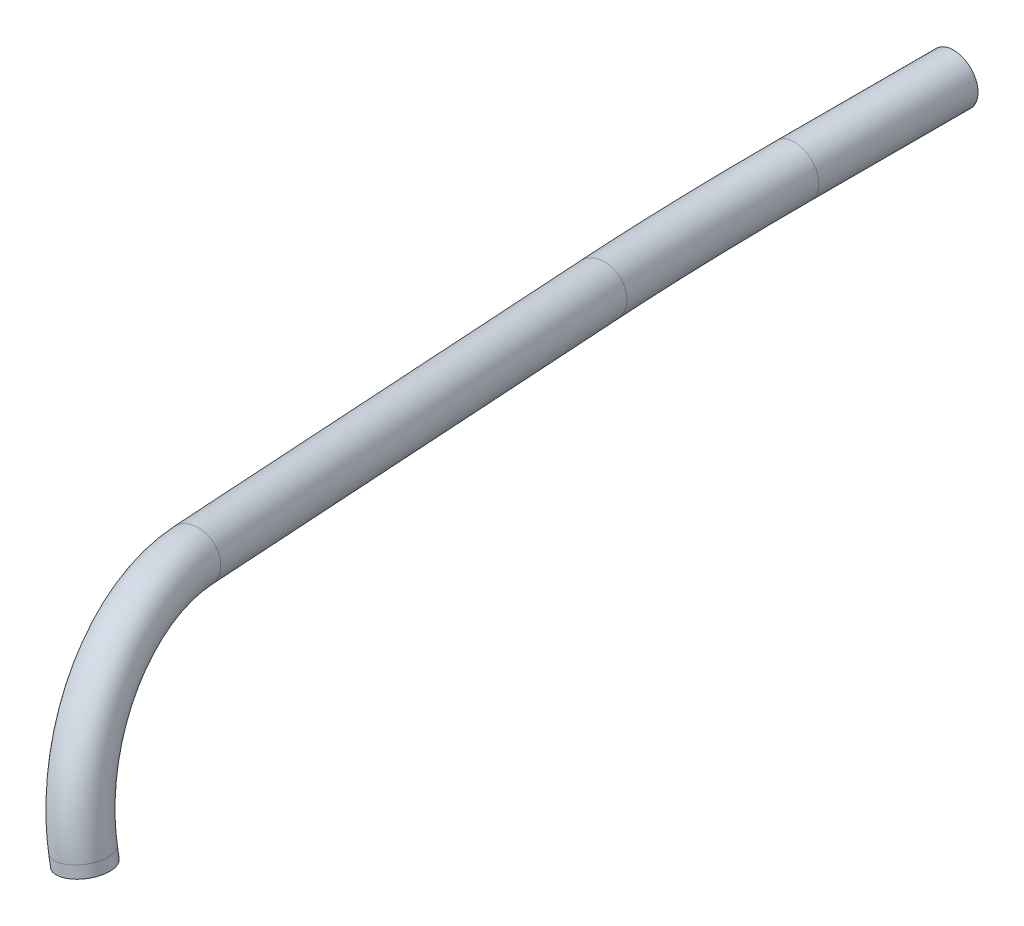
ISO-10303-21;
HEADER;
FILE_DESCRIPTION(('STEP AP214'),'2;1');
FILE_NAME('part.step','',(''),(''),'','','');
FILE_SCHEMA(('AUTOMOTIVE_DESIGN { 1 0 10303 214 1 1 1 1 }'));
ENDSEC;
DATA;
#1=APPLICATION_CONTEXT('core data for automotive mechanical design processes');
#2=APPLICATION_PROTOCOL_DEFINITION('international standard','automotive_design',2000,#1);
#3=PRODUCT_CONTEXT('',#1,'mechanical');
#4=PRODUCT('Part','Part','',(#3));
#5=PRODUCT_RELATED_PRODUCT_CATEGORY('part','',(#4));
#6=PRODUCT_DEFINITION_FORMATION('','',#4);
#7=PRODUCT_DEFINITION_CONTEXT('part definition',#1,'design');
#8=PRODUCT_DEFINITION('design','',#6,#7);
#9=PRODUCT_DEFINITION_SHAPE('','',#8);
#10=(LENGTH_UNIT() NAMED_UNIT(*) SI_UNIT(.MILLI.,.METRE.));
#11=(NAMED_UNIT(*) PLANE_ANGLE_UNIT() SI_UNIT($,.RADIAN.));
#12=(NAMED_UNIT(*) SI_UNIT($,.STERADIAN.) SOLID_ANGLE_UNIT());
#13=UNCERTAINTY_MEASURE_WITH_UNIT(LENGTH_MEASURE(1.E-05),#10,'distance_accuracy_value','');
#14=(GEOMETRIC_REPRESENTATION_CONTEXT(3) GLOBAL_UNCERTAINTY_ASSIGNED_CONTEXT((#13)) GLOBAL_UNIT_ASSIGNED_CONTEXT((#10,
#11,#12)) REPRESENTATION_CONTEXT('',''));
#15=CARTESIAN_POINT('',(0.,0.,0.));
#16=DIRECTION('',(0.,0.,1.));
#17=DIRECTION('',(1.,0.,0.));
#18=AXIS2_PLACEMENT_3D('',#15,#16,#17);
#19=CARTESIAN_POINT('',(11.3636634510779,-8.52088718881167,81.7069688917565));
#20=DIRECTION('',(0.189205503077705,-0.981664706530247,0.0231447954840272));
#21=DIRECTION('',(0.981927742052137,0.189256200396164,0.));
#22=AXIS2_PLACEMENT_3D('',#19,#20,#21);
#23=PLANE('',#22);
#24=CARTESIAN_POINT('',(11.3636634510771,-8.52088718881181,81.7069688917565));
#25=DIRECTION('',(0.189205503077705,-0.981664706530247,0.0231447954840213));
#26=DIRECTION('',(0.981927742052137,0.189256200396163,0.));
#27=AXIS2_PLACEMENT_3D('',#24,#25,#26);
#28=CIRCLE('',#27,1.98119999999999);
#29=CARTESIAN_POINT('',(13.3090586936308,-8.14593280458693,81.7069688917565));
#30=VERTEX_POINT('',#29);
#31=EDGE_CURVE('E17',#30,#30,#28,.F.);
#32=ORIENTED_EDGE('',*,*,#31,.F.);
#33=EDGE_LOOP('',(#32));
#34=FACE_BOUND('',#33,.T.);
#35=ADVANCED_FACE('F14',(#34),#23,.T.);
#36=CARTESIAN_POINT('',(0.,0.,0.));
#37=DIRECTION('',(0.,0.,1.));
#38=DIRECTION('',(1.,0.,0.));
#39=AXIS2_PLACEMENT_3D('',#36,#37,#38);
#40=PLANE('',#39);
#41=CARTESIAN_POINT('',(-1.44293222776741E-12,0.,0.));
#42=DIRECTION('',(0.,0.,-1.));
#43=DIRECTION('',(-1.,0.,0.));
#44=AXIS2_PLACEMENT_3D('',#41,#42,#43);
#45=CIRCLE('',#44,1.98119999999999);
#46=CARTESIAN_POINT('',(-1.98120000000143,0.,0.));
#47=VERTEX_POINT('',#46);
#48=EDGE_CURVE('E96',#47,#47,#45,.F.);
#49=ORIENTED_EDGE('',*,*,#48,.F.);
#50=EDGE_LOOP('',(#49));
#51=FACE_BOUND('',#50,.T.);
#52=ADVANCED_FACE('F50',(#51),#40,.F.);
#53=CARTESIAN_POINT('',(11.1899213795211,-7.6194522045665,81.6857156795205));
#54=DIRECTION('',(0.189205503077705,-0.981664706530247,0.0231447954840213));
#55=DIRECTION('',(0.981927742052137,0.189256200396163,0.));
#56=AXIS2_PLACEMENT_3D('',#53,#54,#55);
#57=CYLINDRICAL_SURFACE('',#56,1.98119999999999);
#58=ORIENTED_EDGE('',*,*,#31,.T.);
#59=EDGE_LOOP('',(#58));
#60=FACE_BOUND('',#59,.T.);
#61=CARTESIAN_POINT('',(11.189921379523,-7.6194522045662,81.6857156795207));
#62=DIRECTION('',(0.189205503077687,-0.981664706530253,0.023144795483918));
#63=DIRECTION('',(0.149993366365971,0.0521875012656855,0.987308692738927));
#64=AXIS2_PLACEMENT_3D('',#61,#62,#63);
#65=CIRCLE('',#64,1.9812);
#66=CARTESIAN_POINT('',(11.4870882369672,-7.51605832705862,83.6417716615751));
#67=VERTEX_POINT('',#66);
#68=EDGE_CURVE('E98',#67,#67,#65,.F.);
#69=ORIENTED_EDGE('',*,*,#68,.F.);
#70=EDGE_LOOP('',(#69));
#71=FACE_BOUND('',#70,.T.);
#72=ADVANCED_FACE('F47',(#60,#71),#57,.T.);
#73=CARTESIAN_POINT('',(-1.4432899320127E-12,0.,12.8876536464685));
#74=DIRECTION('',(0.,0.,-1.));
#75=DIRECTION('',(-1.,0.,0.));
#76=AXIS2_PLACEMENT_3D('',#73,#74,#75);
#77=CYLINDRICAL_SURFACE('',#76,1.98119999999999);
#78=CARTESIAN_POINT('',(-4.9960036108132E-13,-1.78329573330416E-12,12.8876536464687));
#79=DIRECTION('',(0.,0.,1.));
#80=DIRECTION('',(-0.853939113803536,-0.520372933497153,0.));
#81=AXIS2_PLACEMENT_3D('',#78,#79,#80);
#82=CIRCLE('',#81,1.9812);
#83=CARTESIAN_POINT('',(-1.69182417226806,-1.03096285584634,12.8876536464687));
#84=VERTEX_POINT('',#83);
#85=EDGE_CURVE('E26',#84,#84,#82,.T.);
#86=ORIENTED_EDGE('',*,*,#85,.F.);
#87=EDGE_LOOP('',(#86));
#88=FACE_BOUND('',#87,.T.);
#89=ORIENTED_EDGE('',*,*,#48,.T.);
#90=EDGE_LOOP('',(#89));
#91=FACE_BOUND('',#90,.T.);
#92=ADVANCED_FACE('F43',(#88,#91),#77,.T.);
#93=CARTESIAN_POINT('',(86.7602139624387,52.8698900433089,12.8876536464686));
#94=DIRECTION('',(-0.520372933497153,0.853939113803536,0.));
#95=DIRECTION('',(-0.853939113803536,-0.520372933497153,0.));
#96=AXIS2_PLACEMENT_3D('',#93,#94,#95);
#97=TOROIDAL_SURFACE('',#96,101.6,1.9812);
#98=ORIENTED_EDGE('',*,*,#85,.T.);
#99=EDGE_LOOP('',(#98));
#100=FACE_BOUND('',#99,.T.);
#101=CARTESIAN_POINT('',(1.22752402086612,0.748027892562786,29.9179336587762));
#102=DIRECTION('',(0.143138013991499,0.0872253618925456,0.985851533037954));
#103=DIRECTION('',(0.989623378879051,0.,-0.143685656820752));
#104=AXIS2_PLACEMENT_3D('',#101,#102,#103);
#105=CIRCLE('',#104,1.9812);
#106=CARTESIAN_POINT('',(3.1881658591013,0.748027892562786,29.6332636354829));
#107=VERTEX_POINT('',#106);
#108=EDGE_CURVE('E21',#107,#107,#105,.T.);
#109=ORIENTED_EDGE('',*,*,#108,.F.);
#110=EDGE_LOOP('',(#109));
#111=FACE_BOUND('',#110,.T.);
#112=ADVANCED_FACE('F39',(#100,#111),#97,.T.);
#113=CARTESIAN_POINT('',(9.28500562667511,-8.28223347064039,69.1468952817363));
#114=DIRECTION('',(0.970413967155937,0.183332672114158,-0.157117356406478));
#115=DIRECTION('',(-0.185638311225869,0.98261814424791,0.));
#116=AXIS2_PLACEMENT_3D('',#113,#114,#115);
#117=TOROIDAL_SURFACE('',#116,12.7,1.9812);
#118=ORIENTED_EDGE('',*,*,#68,.T.);
#119=EDGE_LOOP('',(#118));
#120=FACE_BOUND('',#119,.T.);
#121=CARTESIAN_POINT('',(6.81557426719783,4.15327078659205,68.4051792787024));
#122=DIRECTION('',(0.143138013991499,0.0872253618925456,0.985851533037954));
#123=DIRECTION('',(0.989623378879051,0.,-0.143685656820752));
#124=AXIS2_PLACEMENT_3D('',#121,#122,#123);
#125=CIRCLE('',#124,1.9812);
#126=CARTESIAN_POINT('',(8.77621610543301,4.15327078659205,68.1205092554091));
#127=VERTEX_POINT('',#126);
#128=EDGE_CURVE('E10',#127,#127,#125,.F.);
#129=ORIENTED_EDGE('',*,*,#128,.F.);
#130=EDGE_LOOP('',(#129));
#131=FACE_BOUND('',#130,.T.);
#132=ADVANCED_FACE('F34',(#120,#131),#117,.T.);
#133=CARTESIAN_POINT('',(1.22752402086612,0.748027892562786,29.9179336587762));
#134=DIRECTION('',(0.143138013991499,0.0872253618925456,0.985851533037954));
#135=DIRECTION('',(0.989623378879051,0.,-0.143685656820752));
#136=AXIS2_PLACEMENT_3D('',#133,#134,#135);
#137=CYLINDRICAL_SURFACE('',#136,1.9812);
#138=ORIENTED_EDGE('',*,*,#108,.T.);
#139=EDGE_LOOP('',(#138));
#140=FACE_BOUND('',#139,.T.);
#141=ORIENTED_EDGE('',*,*,#128,.T.);
#142=EDGE_LOOP('',(#141));
#143=FACE_BOUND('',#142,.T.);
#144=ADVANCED_FACE('F38',(#140,#143),#137,.T.);
#145=CLOSED_SHELL('',(#35,#52,#72,#92,#112,#132,#144));
#146=MANIFOLD_SOLID_BREP('B1',#145);
#147=ADVANCED_BREP_SHAPE_REPRESENTATION('',(#18,#146),#14);
#148=SHAPE_DEFINITION_REPRESENTATION(#9,#147);
ENDSEC;
END-ISO-10303-21;
